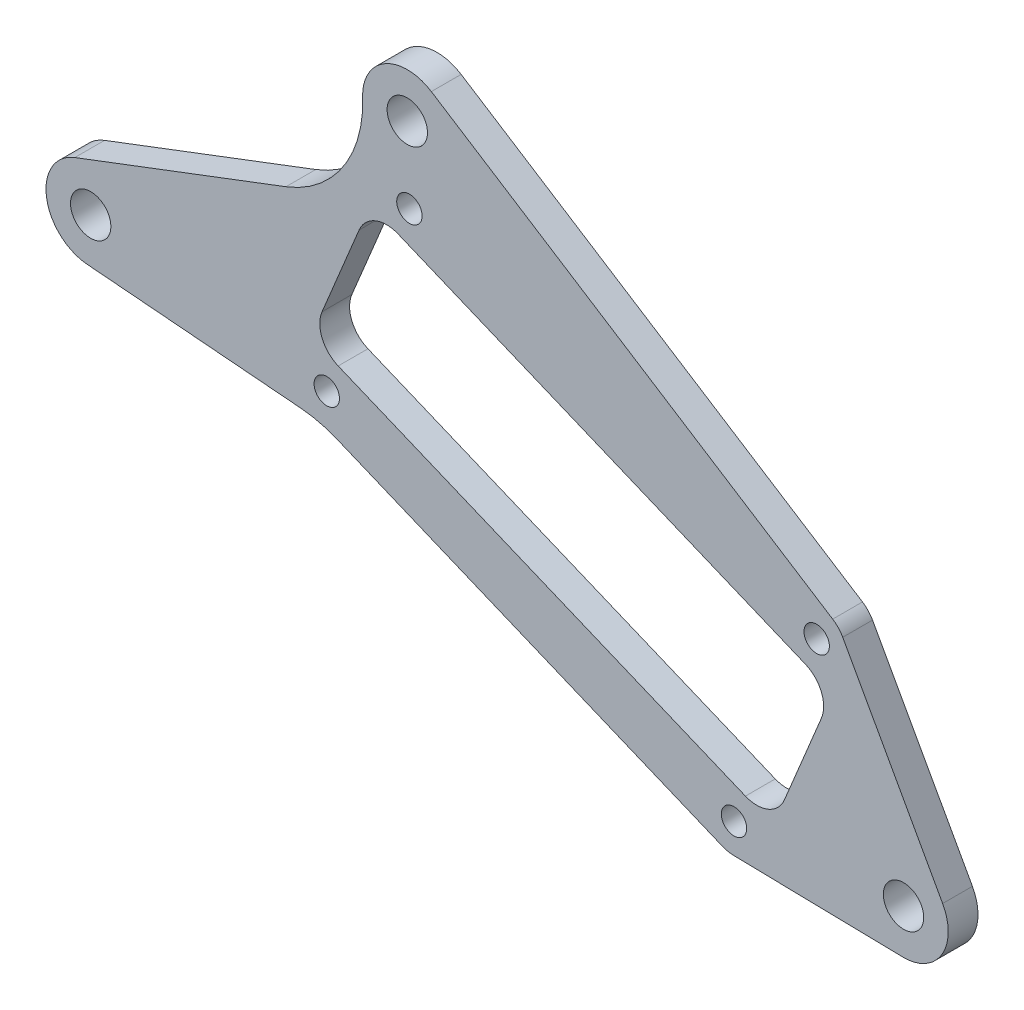
ISO-10303-21;
HEADER;
FILE_DESCRIPTION(('STEP AP214'),'2;1');
FILE_NAME('part.step','',(''),(''),'','','');
FILE_SCHEMA(('AUTOMOTIVE_DESIGN { 1 0 10303 214 1 1 1 1 }'));
ENDSEC;
DATA;
#1=APPLICATION_CONTEXT('core data for automotive mechanical design processes');
#2=APPLICATION_PROTOCOL_DEFINITION('international standard','automotive_design',2000,#1);
#3=PRODUCT_CONTEXT('',#1,'mechanical');
#4=PRODUCT('Part','Part','',(#3));
#5=PRODUCT_RELATED_PRODUCT_CATEGORY('part','',(#4));
#6=PRODUCT_DEFINITION_FORMATION('','',#4);
#7=PRODUCT_DEFINITION_CONTEXT('part definition',#1,'design');
#8=PRODUCT_DEFINITION('design','',#6,#7);
#9=PRODUCT_DEFINITION_SHAPE('','',#8);
#10=(LENGTH_UNIT() NAMED_UNIT(*) SI_UNIT(.MILLI.,.METRE.));
#11=(NAMED_UNIT(*) PLANE_ANGLE_UNIT() SI_UNIT($,.RADIAN.));
#12=(NAMED_UNIT(*) SI_UNIT($,.STERADIAN.) SOLID_ANGLE_UNIT());
#13=UNCERTAINTY_MEASURE_WITH_UNIT(LENGTH_MEASURE(1.E-05),#10,'distance_accuracy_value','');
#14=(GEOMETRIC_REPRESENTATION_CONTEXT(3) GLOBAL_UNCERTAINTY_ASSIGNED_CONTEXT((#13)) GLOBAL_UNIT_ASSIGNED_CONTEXT((#10,
#11,#12)) REPRESENTATION_CONTEXT('',''));
#15=CARTESIAN_POINT('',(0.,0.,0.));
#16=DIRECTION('',(0.,0.,1.));
#17=DIRECTION('',(1.,0.,0.));
#18=AXIS2_PLACEMENT_3D('',#15,#16,#17);
#19=CARTESIAN_POINT('',(3.6054487883952,8.69459000092925,3.175));
#20=DIRECTION('',(-0.383049008063236,-0.923728021347069,0.));
#21=DIRECTION('',(0.923728021347069,-0.383049008063236,0.));
#22=AXIS2_PLACEMENT_3D('',#19,#20,#21);
#23=PLANE('',#22);
#24=DIRECTION('',(-0.923728021347069,0.383049008063236,0.));
#25=VECTOR('',#24,1.);
#26=CARTESIAN_POINT('',(3.6054487883952,8.69459000092925,3.175));
#27=LINE('',#26,#25);
#28=CARTESIAN_POINT('',(69.7997987981253,-18.7547019168819,3.175));
#29=VERTEX_POINT('',#28);
#30=CARTESIAN_POINT('',(26.384581794813,-0.751398537909783,3.175));
#31=VERTEX_POINT('',#30);
#32=EDGE_CURVE('E228',#29,#31,#27,.T.);
#33=ORIENTED_EDGE('',*,*,#32,.F.);
#34=DIRECTION('',(0.,0.,-1.));
#35=VECTOR('',#34,1.);
#36=CARTESIAN_POINT('',(69.7997987981252,-18.7547019168819,3.175));
#37=LINE('',#36,#35);
#38=CARTESIAN_POINT('',(69.7997987981253,-18.7547019168819,0.));
#39=VERTEX_POINT('',#38);
#40=EDGE_CURVE('E297',#29,#39,#37,.T.);
#41=ORIENTED_EDGE('',*,*,#40,.T.);
#42=DIRECTION('',(-0.923728021347069,0.383049008063236,0.));
#43=VECTOR('',#42,1.);
#44=CARTESIAN_POINT('',(3.6054487883952,8.69459000092925,0.));
#45=LINE('',#44,#43);
#46=CARTESIAN_POINT('',(26.384581794813,-0.751398537909783,0.));
#47=VERTEX_POINT('',#46);
#48=EDGE_CURVE('E269',#39,#47,#45,.T.);
#49=ORIENTED_EDGE('',*,*,#48,.T.);
#50=DIRECTION('',(0.,0.,-1.));
#51=VECTOR('',#50,1.);
#52=CARTESIAN_POINT('',(26.384581794813,-0.751398537909778,3.175));
#53=LINE('',#52,#51);
#54=EDGE_CURVE('E201',#47,#31,#53,.F.);
#55=ORIENTED_EDGE('',*,*,#54,.T.);
#56=EDGE_LOOP('',(#33,#41,#49,#55));
#57=FACE_BOUND('',#56,.T.);
#58=ADVANCED_FACE('F35',(#57),#23,.F.);
#59=CARTESIAN_POINT('',(19.8462965386409,-8.22980793823825,3.175));
#60=DIRECTION('',(-0.923728021347069,0.383049008063236,0.));
#61=DIRECTION('',(-0.383049008063236,-0.923728021347069,0.));
#62=AXIS2_PLACEMENT_3D('',#59,#60,#61);
#63=PLANE('',#62);
#64=DIRECTION('',(0.383049008063236,0.923728021347069,0.));
#65=VECTOR('',#64,1.);
#66=CARTESIAN_POINT('',(19.8462965386409,-8.22980793823825,3.175));
#67=LINE('',#66,#65);
#68=CARTESIAN_POINT('',(24.6679259276368,3.39761853046795,3.175));
#69=VERTEX_POINT('',#68);
#70=CARTESIAN_POINT('',(28.6133307106882,12.9120171503427,3.175));
#71=VERTEX_POINT('',#70);
#72=EDGE_CURVE('E231',#69,#71,#67,.T.);
#73=ORIENTED_EDGE('',*,*,#72,.F.);
#74=DIRECTION('',(0.,0.,-1.));
#75=VECTOR('',#74,1.);
#76=CARTESIAN_POINT('',(24.6679259276368,3.39761853046794,0.));
#77=LINE('',#76,#75);
#78=CARTESIAN_POINT('',(24.6679259276368,3.39761853046795,0.));
#79=VERTEX_POINT('',#78);
#80=EDGE_CURVE('E312',#69,#79,#77,.T.);
#81=ORIENTED_EDGE('',*,*,#80,.T.);
#82=DIRECTION('',(0.383049008063236,0.923728021347069,0.));
#83=VECTOR('',#82,1.);
#84=CARTESIAN_POINT('',(19.8462965386409,-8.22980793823825,0.));
#85=LINE('',#84,#83);
#86=CARTESIAN_POINT('',(28.6133307106882,12.9120171503427,0.));
#87=VERTEX_POINT('',#86);
#88=EDGE_CURVE('E272',#79,#87,#85,.T.);
#89=ORIENTED_EDGE('',*,*,#88,.T.);
#90=DIRECTION('',(0.,0.,-1.));
#91=VECTOR('',#90,1.);
#92=CARTESIAN_POINT('',(28.6133307106882,12.9120171503427,3.175));
#93=LINE('',#92,#91);
#94=EDGE_CURVE('E310',#87,#71,#93,.F.);
#95=ORIENTED_EDGE('',*,*,#94,.T.);
#96=EDGE_LOOP('',(#73,#81,#89,#95));
#97=FACE_BOUND('',#96,.T.);
#98=ADVANCED_FACE('F364',(#97),#63,.F.);
#99=CARTESIAN_POINT('',(9.98321477264808,24.0746615563579,3.175));
#100=DIRECTION('',(-0.383049008063236,-0.923728021347069,0.));
#101=DIRECTION('',(0.923728021347069,-0.383049008063236,0.));
#102=AXIS2_PLACEMENT_3D('',#99,#100,#101);
#103=PLANE('',#102);
#104=DIRECTION('',(-0.923728021347069,0.383049008063236,0.));
#105=VECTOR('',#104,1.);
#106=CARTESIAN_POINT('',(9.98321477264808,24.0746615563579,0.));
#107=LINE('',#106,#105);
#108=CARTESIAN_POINT('',(76.1775647823781,-3.37463036145321,0.));
#109=VERTEX_POINT('',#108);
#110=CARTESIAN_POINT('',(32.7623477790659,14.6286730175189,0.));
#111=VERTEX_POINT('',#110);
#112=EDGE_CURVE('E275',#109,#111,#107,.T.);
#113=ORIENTED_EDGE('',*,*,#112,.F.);
#114=DIRECTION('',(0.,0.,-1.));
#115=VECTOR('',#114,1.);
#116=CARTESIAN_POINT('',(76.1775647823781,-3.37463036145321,3.175));
#117=LINE('',#116,#115);
#118=CARTESIAN_POINT('',(76.1775647823781,-3.37463036145321,3.175));
#119=VERTEX_POINT('',#118);
#120=EDGE_CURVE('E308',#109,#119,#117,.F.);
#121=ORIENTED_EDGE('',*,*,#120,.T.);
#122=DIRECTION('',(-0.923728021347069,0.383049008063236,0.));
#123=VECTOR('',#122,1.);
#124=CARTESIAN_POINT('',(9.98321477264808,24.0746615563579,3.175));
#125=LINE('',#124,#123);
#126=CARTESIAN_POINT('',(32.7623477790659,14.6286730175189,3.175));
#127=VERTEX_POINT('',#126);
#128=EDGE_CURVE('E234',#119,#127,#125,.T.);
#129=ORIENTED_EDGE('',*,*,#128,.T.);
#130=DIRECTION('',(0.,0.,-1.));
#131=VECTOR('',#130,1.);
#132=CARTESIAN_POINT('',(32.7623477790659,14.6286730175189,3.175));
#133=LINE('',#132,#131);
#134=EDGE_CURVE('E305',#127,#111,#133,.T.);
#135=ORIENTED_EDGE('',*,*,#134,.T.);
#136=EDGE_LOOP('',(#113,#121,#129,#135));
#137=FACE_BOUND('',#136,.T.);
#138=ADVANCED_FACE('F370',(#137),#103,.T.);
#139=CARTESIAN_POINT('',(-0.39436124862565,-4.74614427252084,3.175));
#140=DIRECTION('',(0.0828055115224462,0.996565726513563,0.));
#141=DIRECTION('',(-0.996565726513563,0.0828055115224462,0.));
#142=AXIS2_PLACEMENT_3D('',#139,#140,#141);
#143=PLANE('',#142);
#144=DIRECTION('',(0.996565726513563,-0.0828055115224462,0.));
#145=VECTOR('',#144,1.);
#146=CARTESIAN_POINT('',(-0.39436124862565,-4.74614427252084,0.));
#147=LINE('',#146,#145);
#148=CARTESIAN_POINT('',(-0.39436124862565,-4.74614427252084,0.));
#149=VERTEX_POINT('',#148);
#150=CARTESIAN_POINT('',(22.4319156239674,-6.64279943765543,0.));
#151=VERTEX_POINT('',#150);
#152=EDGE_CURVE('E241',#149,#151,#147,.T.);
#153=ORIENTED_EDGE('',*,*,#152,.T.);
#154=DIRECTION('',(0.,0.,-1.));
#155=VECTOR('',#154,1.);
#156=CARTESIAN_POINT('',(22.4319156239674,-6.64279943765543,3.175));
#157=LINE('',#156,#155);
#158=CARTESIAN_POINT('',(22.4319156239674,-6.64279943765543,3.175));
#159=VERTEX_POINT('',#158);
#160=EDGE_CURVE('E333',#151,#159,#157,.F.);
#161=ORIENTED_EDGE('',*,*,#160,.T.);
#162=DIRECTION('',(0.996565726513563,-0.0828055115224462,0.));
#163=VECTOR('',#162,1.);
#164=CARTESIAN_POINT('',(-0.39436124862565,-4.74614427252084,3.175));
#165=LINE('',#164,#163);
#166=CARTESIAN_POINT('',(-0.39436124862565,-4.74614427252084,3.175));
#167=VERTEX_POINT('',#166);
#168=EDGE_CURVE('E191',#167,#159,#165,.T.);
#169=ORIENTED_EDGE('',*,*,#168,.F.);
#170=DIRECTION('',(0.,0.,-1.));
#171=VECTOR('',#170,1.);
#172=CARTESIAN_POINT('',(-0.39436124862565,-4.74614427252084,3.175));
#173=LINE('',#172,#171);
#174=EDGE_CURVE('E240',#167,#149,#173,.T.);
#175=ORIENTED_EDGE('',*,*,#174,.T.);
#176=EDGE_LOOP('',(#153,#161,#169,#175));
#177=FACE_BOUND('',#176,.T.);
#178=ADVANCED_FACE('F348',(#177),#143,.F.);
#179=CARTESIAN_POINT('',(1.17308758719365,2.82891706537536,3.175));
#180=DIRECTION('',(0.383049008063236,0.923728021347069,0.));
#181=DIRECTION('',(-0.923728021347069,0.383049008063236,0.));
#182=AXIS2_PLACEMENT_3D('',#179,#180,#181);
#183=PLANE('',#182);
#184=DIRECTION('',(0.923728021347069,-0.383049008063236,0.));
#185=VECTOR('',#184,1.);
#186=CARTESIAN_POINT('',(1.17308758719365,2.82891706537536,3.175));
#187=LINE('',#186,#185);
#188=CARTESIAN_POINT('',(26.2450080300355,-7.56783829326991,3.175));
#189=VERTEX_POINT('',#188);
#190=CARTESIAN_POINT('',(67.3674375969237,-24.6203748524358,3.175));
#191=VERTEX_POINT('',#190);
#192=EDGE_CURVE('E177',#189,#191,#187,.T.);
#193=ORIENTED_EDGE('',*,*,#192,.F.);
#194=DIRECTION('',(0.,0.,-1.));
#195=VECTOR('',#194,1.);
#196=CARTESIAN_POINT('',(26.2450080300355,-7.56783829326991,0.));
#197=LINE('',#196,#195);
#198=CARTESIAN_POINT('',(26.2450080300355,-7.56783829326991,0.));
#199=VERTEX_POINT('',#198);
#200=EDGE_CURVE('E331',#189,#199,#197,.T.);
#201=ORIENTED_EDGE('',*,*,#200,.T.);
#202=DIRECTION('',(0.923728021347069,-0.383049008063236,0.));
#203=VECTOR('',#202,1.);
#204=CARTESIAN_POINT('',(1.17308758719365,2.82891706537536,0.));
#205=LINE('',#204,#203);
#206=CARTESIAN_POINT('',(67.3674375969237,-24.6203748524358,0.));
#207=VERTEX_POINT('',#206);
#208=EDGE_CURVE('E197',#199,#207,#205,.T.);
#209=ORIENTED_EDGE('',*,*,#208,.T.);
#210=DIRECTION('',(0.,0.,-1.));
#211=VECTOR('',#210,1.);
#212=CARTESIAN_POINT('',(67.3674375969237,-24.6203748524358,3.175));
#213=LINE('',#212,#211);
#214=EDGE_CURVE('E194',#191,#207,#213,.T.);
#215=ORIENTED_EDGE('',*,*,#214,.F.);
#216=EDGE_LOOP('',(#193,#201,#209,#215));
#217=FACE_BOUND('',#216,.T.);
#218=ADVANCED_FACE('F195',(#217),#183,.F.);
#219=CARTESIAN_POINT('',(68.5836181975244,-21.6875383846588,3.175));
#220=DIRECTION('',(0.,0.,-1.));
#221=DIRECTION('',(-1.,0.,0.));
#222=AXIS2_PLACEMENT_3D('',#219,#220,#221);
#223=CYLINDRICAL_SURFACE('',#222,3.175);
#224=CARTESIAN_POINT('',(68.5836181975244,-21.6875383846588,0.));
#225=DIRECTION('',(0.,0.,1.));
#226=DIRECTION('',(1.,0.,0.));
#227=AXIS2_PLACEMENT_3D('',#224,#225,#226);
#228=CIRCLE('',#227,3.175);
#229=CARTESIAN_POINT('',(68.519252784024,-24.8618858913986,0.));
#230=VERTEX_POINT('',#229);
#231=EDGE_CURVE('E246',#207,#230,#228,.T.);
#232=ORIENTED_EDGE('',*,*,#231,.T.);
#233=DIRECTION('',(0.,0.,-1.));
#234=VECTOR('',#233,1.);
#235=CARTESIAN_POINT('',(68.519252784024,-24.8618858913986,3.175));
#236=LINE('',#235,#234);
#237=CARTESIAN_POINT('',(68.519252784024,-24.8618858913986,3.175));
#238=VERTEX_POINT('',#237);
#239=EDGE_CURVE('E202',#238,#230,#236,.T.);
#240=ORIENTED_EDGE('',*,*,#239,.F.);
#241=CARTESIAN_POINT('',(68.5836181975244,-21.6875383846588,3.175));
#242=DIRECTION('',(0.,0.,1.));
#243=DIRECTION('',(1.,0.,0.));
#244=AXIS2_PLACEMENT_3D('',#241,#242,#243);
#245=CIRCLE('',#244,3.175);
#246=EDGE_CURVE('E184',#191,#238,#245,.T.);
#247=ORIENTED_EDGE('',*,*,#246,.F.);
#248=ORIENTED_EDGE('',*,*,#214,.T.);
#249=EDGE_LOOP('',(#232,#240,#247,#248));
#250=FACE_BOUND('',#249,.T.);
#251=ADVANCED_FACE('F204',(#250),#223,.T.);
#252=CARTESIAN_POINT('',(-0.47575092489974,-23.4628922608135,3.175));
#253=DIRECTION('',(-0.0202725711812555,-0.999794490311734,0.));
#254=DIRECTION('',(0.999794490311735,-0.0202725711812555,0.));
#255=AXIS2_PLACEMENT_3D('',#252,#253,#254);
#256=PLANE('',#255);
#257=DIRECTION('',(-0.999794490311735,0.0202725711812555,0.));
#258=VECTOR('',#257,1.);
#259=CARTESIAN_POINT('',(-0.47575092489974,-23.4628922608135,0.));
#260=LINE('',#259,#258);
#261=CARTESIAN_POINT('',(86.5571780105177,-25.2276361797426,0.));
#262=VERTEX_POINT('',#261);
#263=EDGE_CURVE('E248',#262,#230,#260,.T.);
#264=ORIENTED_EDGE('',*,*,#263,.F.);
#265=DIRECTION('',(0.,0.,-1.));
#266=VECTOR('',#265,1.);
#267=CARTESIAN_POINT('',(86.5571780105177,-25.2276361797426,3.175));
#268=LINE('',#267,#266);
#269=CARTESIAN_POINT('',(86.5571780105177,-25.2276361797426,3.175));
#270=VERTEX_POINT('',#269);
#271=EDGE_CURVE('E293',#270,#262,#268,.T.);
#272=ORIENTED_EDGE('',*,*,#271,.F.);
#273=DIRECTION('',(-0.999794490311735,0.0202725711812555,0.));
#274=VECTOR('',#273,1.);
#275=CARTESIAN_POINT('',(-0.47575092489974,-23.4628922608135,3.175));
#276=LINE('',#275,#274);
#277=EDGE_CURVE('E206',#270,#238,#276,.T.);
#278=ORIENTED_EDGE('',*,*,#277,.T.);
#279=ORIENTED_EDGE('',*,*,#239,.T.);
#280=EDGE_LOOP('',(#264,#272,#278,#279));
#281=FACE_BOUND('',#280,.T.);
#282=ADVANCED_FACE('F403',(#281),#256,.T.);
#283=CARTESIAN_POINT('',(86.6537261307684,-20.4661149196329,3.175));
#284=DIRECTION('',(0.,0.,-1.));
#285=DIRECTION('',(-1.,0.,0.));
#286=AXIS2_PLACEMENT_3D('',#283,#284,#285);
#287=CYLINDRICAL_SURFACE('',#286,4.7625);
#288=CARTESIAN_POINT('',(86.6537261307684,-20.4661149196329,0.));
#289=DIRECTION('',(0.,0.,1.));
#290=DIRECTION('',(1.,0.,0.));
#291=AXIS2_PLACEMENT_3D('',#288,#289,#290);
#292=CIRCLE('',#291,4.7625);
#293=CARTESIAN_POINT('',(90.8213588264663,-18.1612843480398,0.));
#294=VERTEX_POINT('',#293);
#295=EDGE_CURVE('E251',#262,#294,#292,.T.);
#296=ORIENTED_EDGE('',*,*,#295,.T.);
#297=DIRECTION('',(0.,0.,-1.));
#298=VECTOR('',#297,1.);
#299=CARTESIAN_POINT('',(90.8213588264663,-18.1612843480398,3.175));
#300=LINE('',#299,#298);
#301=CARTESIAN_POINT('',(90.8213588264663,-18.1612843480398,3.175));
#302=VERTEX_POINT('',#301);
#303=EDGE_CURVE('E291',#302,#294,#300,.T.);
#304=ORIENTED_EDGE('',*,*,#303,.F.);
#305=CARTESIAN_POINT('',(86.6537261307684,-20.4661149196329,3.175));
#306=DIRECTION('',(0.,0.,1.));
#307=DIRECTION('',(1.,0.,0.));
#308=AXIS2_PLACEMENT_3D('',#305,#306,#307);
#309=CIRCLE('',#308,4.7625);
#310=EDGE_CURVE('E208',#270,#302,#309,.T.);
#311=ORIENTED_EDGE('',*,*,#310,.F.);
#312=ORIENTED_EDGE('',*,*,#271,.T.);
#313=EDGE_LOOP('',(#296,#304,#311,#312));
#314=FACE_BOUND('',#313,.T.);
#315=ADVANCED_FACE('F399',(#314),#287,.T.);
#316=CARTESIAN_POINT('',(61.8585676556728,34.2097128652754,3.175));
#317=DIRECTION('',(0.87509347941162,0.483953925793834,0.));
#318=DIRECTION('',(-0.483953925793834,0.875093479411621,0.));
#319=AXIS2_PLACEMENT_3D('',#316,#317,#318);
#320=PLANE('',#319);
#321=DIRECTION('',(0.483953925793834,-0.875093479411621,0.));
#322=VECTOR('',#321,1.);
#323=CARTESIAN_POINT('',(61.8585676556728,34.2097128652754,0.));
#324=LINE('',#323,#322);
#325=CARTESIAN_POINT('',(80.1721671801108,1.09475982071917,0.));
#326=VERTEX_POINT('',#325);
#327=EDGE_CURVE('E254',#326,#294,#324,.T.);
#328=ORIENTED_EDGE('',*,*,#327,.F.);
#329=DIRECTION('',(0.,0.,-1.));
#330=VECTOR('',#329,1.);
#331=CARTESIAN_POINT('',(80.1721671801108,1.09475982071917,3.175));
#332=LINE('',#331,#330);
#333=CARTESIAN_POINT('',(80.1721671801108,1.09475982071917,3.175));
#334=VERTEX_POINT('',#333);
#335=EDGE_CURVE('E289',#334,#326,#332,.T.);
#336=ORIENTED_EDGE('',*,*,#335,.F.);
#337=DIRECTION('',(0.483953925793834,-0.875093479411621,0.));
#338=VECTOR('',#337,1.);
#339=CARTESIAN_POINT('',(61.8585676556728,34.2097128652754,3.175));
#340=LINE('',#339,#338);
#341=EDGE_CURVE('E213',#334,#302,#340,.T.);
#342=ORIENTED_EDGE('',*,*,#341,.T.);
#343=ORIENTED_EDGE('',*,*,#303,.T.);
#344=EDGE_LOOP('',(#328,#336,#342,#343));
#345=FACE_BOUND('',#344,.T.);
#346=ADVANCED_FACE('F395',(#345),#320,.T.);
#347=CARTESIAN_POINT('',(77.3937453829789,-0.441793893676247,3.175));
#348=DIRECTION('',(0.,0.,-1.));
#349=DIRECTION('',(-1.,0.,0.));
#350=AXIS2_PLACEMENT_3D('',#347,#348,#349);
#351=CYLINDRICAL_SURFACE('',#350,3.175);
#352=CARTESIAN_POINT('',(77.3937453829789,-0.441793893676247,0.));
#353=DIRECTION('',(0.,0.,1.));
#354=DIRECTION('',(1.,0.,0.));
#355=AXIS2_PLACEMENT_3D('',#352,#353,#354);
#356=CIRCLE('',#355,3.175);
#357=CARTESIAN_POINT('',(79.1020142667995,2.23448008717289,0.));
#358=VERTEX_POINT('',#357);
#359=EDGE_CURVE('E257',#326,#358,#356,.T.);
#360=ORIENTED_EDGE('',*,*,#359,.T.);
#361=DIRECTION('',(0.,0.,-1.));
#362=VECTOR('',#361,1.);
#363=CARTESIAN_POINT('',(79.1020142667995,2.23448008717289,3.175));
#364=LINE('',#363,#362);
#365=CARTESIAN_POINT('',(79.1020142667995,2.23448008717289,3.175));
#366=VERTEX_POINT('',#365);
#367=EDGE_CURVE('E287',#366,#358,#364,.T.);
#368=ORIENTED_EDGE('',*,*,#367,.F.);
#369=CARTESIAN_POINT('',(77.3937453829789,-0.441793893676247,3.175));
#370=DIRECTION('',(0.,0.,1.));
#371=DIRECTION('',(1.,0.,0.));
#372=AXIS2_PLACEMENT_3D('',#369,#370,#371);
#373=CIRCLE('',#372,3.175);
#374=EDGE_CURVE('E216',#334,#366,#373,.T.);
#375=ORIENTED_EDGE('',*,*,#374,.F.);
#376=ORIENTED_EDGE('',*,*,#335,.T.);
#377=EDGE_LOOP('',(#360,#368,#375,#376));
#378=FACE_BOUND('',#377,.T.);
#379=ADVANCED_FACE('F391',(#378),#351,.T.);
#380=CARTESIAN_POINT('',(23.9121786780269,37.4622181715844,3.175));
#381=DIRECTION('',(0.538037443723045,0.842920938850122,0.));
#382=DIRECTION('',(-0.842920938850122,0.538037443723045,0.));
#383=AXIS2_PLACEMENT_3D('',#380,#381,#382);
#384=PLANE('',#383);
#385=DIRECTION('',(0.842920938850122,-0.538037443723045,0.));
#386=VECTOR('',#385,1.);
#387=CARTESIAN_POINT('',(23.9121786780269,37.4622181715844,0.));
#388=LINE('',#387,#386);
#389=CARTESIAN_POINT('',(36.3157980254566,29.5449731026594,0.));
#390=VERTEX_POINT('',#389);
#391=EDGE_CURVE('E260',#390,#358,#388,.T.);
#392=ORIENTED_EDGE('',*,*,#391,.F.);
#393=DIRECTION('',(0.,0.,-1.));
#394=VECTOR('',#393,1.);
#395=CARTESIAN_POINT('',(36.3157980254566,29.5449731026594,3.175));
#396=LINE('',#395,#394);
#397=CARTESIAN_POINT('',(36.3157980254566,29.5449731026594,3.175));
#398=VERTEX_POINT('',#397);
#399=EDGE_CURVE('E285',#398,#390,#396,.T.);
#400=ORIENTED_EDGE('',*,*,#399,.F.);
#401=DIRECTION('',(0.842920938850122,-0.538037443723045,0.));
#402=VECTOR('',#401,1.);
#403=CARTESIAN_POINT('',(23.9121786780269,37.4622181715844,3.175));
#404=LINE('',#403,#402);
#405=EDGE_CURVE('E218',#398,#366,#404,.T.);
#406=ORIENTED_EDGE('',*,*,#405,.T.);
#407=ORIENTED_EDGE('',*,*,#367,.T.);
#408=EDGE_LOOP('',(#392,#400,#406,#407));
#409=FACE_BOUND('',#408,.T.);
#410=ADVANCED_FACE('F388',(#409),#384,.T.);
#411=CARTESIAN_POINT('',(33.7533946997256,25.5305621313857,3.175));
#412=DIRECTION('',(0.,0.,-1.));
#413=DIRECTION('',(-1.,0.,0.));
#414=AXIS2_PLACEMENT_3D('',#411,#412,#413);
#415=CYLINDRICAL_SURFACE('',#414,4.7625);
#416=CARTESIAN_POINT('',(33.7533946997256,25.5305621313857,0.));
#417=DIRECTION('',(0.,0.,1.));
#418=DIRECTION('',(1.,0.,0.));
#419=AXIS2_PLACEMENT_3D('',#416,#417,#418);
#420=CIRCLE('',#419,4.7625);
#421=CARTESIAN_POINT('',(28.9941713479063,25.3539287894091,0.));
#422=VERTEX_POINT('',#421);
#423=EDGE_CURVE('E263',#390,#422,#420,.T.);
#424=ORIENTED_EDGE('',*,*,#423,.T.);
#425=DIRECTION('',(0.,0.,-1.));
#426=VECTOR('',#425,1.);
#427=CARTESIAN_POINT('',(28.9941713479063,25.3539287894091,3.175));
#428=LINE('',#427,#426);
#429=CARTESIAN_POINT('',(28.9941713479063,25.3539287894091,3.175));
#430=VERTEX_POINT('',#429);
#431=EDGE_CURVE('E50',#422,#430,#428,.F.);
#432=ORIENTED_EDGE('',*,*,#431,.T.);
#433=CARTESIAN_POINT('',(33.7533946997256,25.5305621313857,3.175));
#434=DIRECTION('',(0.,0.,1.));
#435=DIRECTION('',(1.,0.,0.));
#436=AXIS2_PLACEMENT_3D('',#433,#434,#435);
#437=CIRCLE('',#436,4.7625);
#438=EDGE_CURVE('E221',#398,#430,#437,.T.);
#439=ORIENTED_EDGE('',*,*,#438,.F.);
#440=ORIENTED_EDGE('',*,*,#399,.T.);
#441=EDGE_LOOP('',(#424,#432,#439,#440));
#442=FACE_BOUND('',#441,.T.);
#443=ADVANCED_FACE('F384',(#442),#415,.T.);
#444=CARTESIAN_POINT('',(-1.69293536920437,4.45144651609978,3.175));
#445=DIRECTION('',(-0.355471993533725,0.93468693251439,0.));
#446=DIRECTION('',(-0.93468693251439,-0.355471993533725,0.));
#447=AXIS2_PLACEMENT_3D('',#444,#445,#446);
#448=PLANE('',#447);
#449=DIRECTION('',(0.93468693251439,0.355471993533725,0.));
#450=VECTOR('',#449,1.);
#451=CARTESIAN_POINT('',(-1.69293536920437,4.45144651609978,3.175));
#452=LINE('',#451,#450);
#453=CARTESIAN_POINT('',(-1.69293536920437,4.45144651609978,3.175));
#454=VERTEX_POINT('',#453);
#455=CARTESIAN_POINT('',(20.8174033942664,13.0123825012054,3.175));
#456=VERTEX_POINT('',#455);
#457=EDGE_CURVE('E223',#454,#456,#452,.T.);
#458=ORIENTED_EDGE('',*,*,#457,.T.);
#459=DIRECTION('',(0.,0.,-1.));
#460=VECTOR('',#459,1.);
#461=CARTESIAN_POINT('',(20.8174033942664,13.0123825012054,3.175));
#462=LINE('',#461,#460);
#463=CARTESIAN_POINT('',(20.8174033942664,13.0123825012054,0.));
#464=VERTEX_POINT('',#463);
#465=EDGE_CURVE('E335',#456,#464,#462,.T.);
#466=ORIENTED_EDGE('',*,*,#465,.T.);
#467=DIRECTION('',(0.93468693251439,0.355471993533725,0.));
#468=VECTOR('',#467,1.);
#469=CARTESIAN_POINT('',(-1.69293536920437,4.45144651609978,0.));
#470=LINE('',#469,#468);
#471=CARTESIAN_POINT('',(-1.69293536920437,4.45144651609978,0.));
#472=VERTEX_POINT('',#471);
#473=EDGE_CURVE('E265',#472,#464,#470,.T.);
#474=ORIENTED_EDGE('',*,*,#473,.F.);
#475=DIRECTION('',(0.,0.,-1.));
#476=VECTOR('',#475,1.);
#477=CARTESIAN_POINT('',(-1.69293536920437,4.45144651609978,3.175));
#478=LINE('',#477,#476);
#479=EDGE_CURVE('E283',#454,#472,#478,.T.);
#480=ORIENTED_EDGE('',*,*,#479,.F.);
#481=EDGE_LOOP('',(#458,#466,#474,#480));
#482=FACE_BOUND('',#481,.T.);
#483=ADVANCED_FACE('F380',(#482),#448,.T.);
#484=CARTESIAN_POINT('',(0.,0.,3.175));
#485=DIRECTION('',(0.,0.,-1.));
#486=DIRECTION('',(-1.,0.,0.));
#487=AXIS2_PLACEMENT_3D('',#484,#485,#486);
#488=CYLINDRICAL_SURFACE('',#487,4.7625);
#489=CARTESIAN_POINT('',(0.,0.,0.));
#490=DIRECTION('',(0.,0.,1.));
#491=DIRECTION('',(1.,0.,0.));
#492=AXIS2_PLACEMENT_3D('',#489,#490,#491);
#493=CIRCLE('',#492,4.7625);
#494=EDGE_CURVE('E267',#472,#149,#493,.T.);
#495=ORIENTED_EDGE('',*,*,#494,.T.);
#496=ORIENTED_EDGE('',*,*,#174,.F.);
#497=CARTESIAN_POINT('',(0.,0.,3.175));
#498=DIRECTION('',(0.,0.,1.));
#499=DIRECTION('',(1.,0.,0.));
#500=AXIS2_PLACEMENT_3D('',#497,#498,#499);
#501=CIRCLE('',#500,4.7625);
#502=EDGE_CURVE('E226',#454,#167,#501,.T.);
#503=ORIENTED_EDGE('',*,*,#502,.F.);
#504=ORIENTED_EDGE('',*,*,#479,.T.);
#505=EDGE_LOOP('',(#495,#496,#503,#504));
#506=FACE_BOUND('',#505,.T.);
#507=ADVANCED_FACE('F376',(#506),#488,.T.);
#508=CARTESIAN_POINT('',(69.1271864775069,-28.665472518412,3.175));
#509=DIRECTION('',(-0.923728021347068,0.383049008063237,0.));
#510=DIRECTION('',(-0.383049008063237,-0.923728021347069,0.));
#511=AXIS2_PLACEMENT_3D('',#508,#509,#510);
#512=PLANE('',#511);
#513=DIRECTION('',(0.383049008063237,0.923728021347069,0.));
#514=VECTOR('',#513,1.);
#515=CARTESIAN_POINT('',(69.1271864775069,-28.665472518412,0.));
#516=LINE('',#515,#514);
#517=CARTESIAN_POINT('',(73.948815866503,-17.0380460497057,0.));
#518=VERTEX_POINT('',#517);
#519=CARTESIAN_POINT('',(77.8942206495543,-7.52364742983092,0.));
#520=VERTEX_POINT('',#519);
#521=EDGE_CURVE('E278',#518,#520,#516,.T.);
#522=ORIENTED_EDGE('',*,*,#521,.F.);
#523=DIRECTION('',(0.,0.,-1.));
#524=VECTOR('',#523,1.);
#525=CARTESIAN_POINT('',(73.948815866503,-17.0380460497057,3.175));
#526=LINE('',#525,#524);
#527=CARTESIAN_POINT('',(73.948815866503,-17.0380460497057,3.175));
#528=VERTEX_POINT('',#527);
#529=EDGE_CURVE('E303',#518,#528,#526,.F.);
#530=ORIENTED_EDGE('',*,*,#529,.T.);
#531=DIRECTION('',(0.383049008063237,0.923728021347069,0.));
#532=VECTOR('',#531,1.);
#533=CARTESIAN_POINT('',(69.1271864775069,-28.665472518412,3.175));
#534=LINE('',#533,#532);
#535=CARTESIAN_POINT('',(77.8942206495543,-7.52364742983092,3.175));
#536=VERTEX_POINT('',#535);
#537=EDGE_CURVE('E237',#528,#536,#534,.T.);
#538=ORIENTED_EDGE('',*,*,#537,.T.);
#539=DIRECTION('',(0.,0.,-1.));
#540=VECTOR('',#539,1.);
#541=CARTESIAN_POINT('',(77.8942206495543,-7.52364742983092,0.));
#542=LINE('',#541,#540);
#543=EDGE_CURVE('E300',#536,#520,#542,.T.);
#544=ORIENTED_EDGE('',*,*,#543,.T.);
#545=EDGE_LOOP('',(#522,#530,#538,#544));
#546=FACE_BOUND('',#545,.T.);
#547=ADVANCED_FACE('F379',(#546),#512,.T.);
#548=CARTESIAN_POINT('',(0.,0.,3.175));
#549=DIRECTION('',(0.,0.,1.));
#550=DIRECTION('',(1.,0.,0.));
#551=AXIS2_PLACEMENT_3D('',#548,#549,#550);
#552=PLANE('',#551);
#553=CARTESIAN_POINT('',(33.9785283796666,17.5615094852959,3.175));
#554=DIRECTION('',(0.,0.,1.));
#555=DIRECTION('',(1.,0.,0.));
#556=AXIS2_PLACEMENT_3D('',#553,#554,#555);
#557=CIRCLE('',#556,1.35254999999999);
#558=CARTESIAN_POINT('',(35.3310783796666,17.5615094852959,3.175));
#559=VERTEX_POINT('',#558);
#560=EDGE_CURVE('E691',#559,#559,#557,.T.);
#561=ORIENTED_EDGE('',*,*,#560,.F.);
#562=EDGE_LOOP('',(#561));
#563=FACE_BOUND('',#562,.T.);
#564=CARTESIAN_POINT('',(77.3937453829789,-0.441793893676247,3.175));
#565=DIRECTION('',(0.,0.,1.));
#566=DIRECTION('',(1.,0.,0.));
#567=AXIS2_PLACEMENT_3D('',#564,#565,#566);
#568=CIRCLE('',#567,1.35254999999999);
#569=CARTESIAN_POINT('',(78.7462953829789,-0.441793893676247,3.175));
#570=VERTEX_POINT('',#569);
#571=EDGE_CURVE('E686',#570,#570,#568,.T.);
#572=ORIENTED_EDGE('',*,*,#571,.F.);
#573=EDGE_LOOP('',(#572));
#574=FACE_BOUND('',#573,.T.);
#575=CARTESIAN_POINT('',(68.5836181975244,-21.6875383846588,3.175));
#576=DIRECTION('',(0.,0.,1.));
#577=DIRECTION('',(1.,0.,0.));
#578=AXIS2_PLACEMENT_3D('',#575,#576,#577);
#579=CIRCLE('',#578,1.35254999999999);
#580=CARTESIAN_POINT('',(69.9361681975244,-21.6875383846588,3.175));
#581=VERTEX_POINT('',#580);
#582=EDGE_CURVE('E680',#581,#581,#579,.T.);
#583=ORIENTED_EDGE('',*,*,#582,.F.);
#584=EDGE_LOOP('',(#583));
#585=FACE_BOUND('',#584,.T.);
#586=CARTESIAN_POINT('',(25.1684011942122,-3.68423500568672,3.175));
#587=DIRECTION('',(0.,0.,1.));
#588=DIRECTION('',(1.,0.,0.));
#589=AXIS2_PLACEMENT_3D('',#586,#587,#588);
#590=CIRCLE('',#589,1.35254999999999);
#591=CARTESIAN_POINT('',(26.5209511942122,-3.68423500568672,3.175));
#592=VERTEX_POINT('',#591);
#593=EDGE_CURVE('E674',#592,#592,#590,.T.);
#594=ORIENTED_EDGE('',*,*,#593,.F.);
#595=EDGE_LOOP('',(#594));
#596=FACE_BOUND('',#595,.T.);
#597=CARTESIAN_POINT('',(0.,0.,3.175));
#598=DIRECTION('',(0.,0.,1.));
#599=DIRECTION('',(1.,0.,0.));
#600=AXIS2_PLACEMENT_3D('',#597,#598,#599);
#601=CIRCLE('',#600,2.15264999999999);
#602=CARTESIAN_POINT('',(2.15264999999999,0.,3.175));
#603=VERTEX_POINT('',#602);
#604=EDGE_CURVE('E641',#603,#603,#601,.T.);
#605=ORIENTED_EDGE('',*,*,#604,.F.);
#606=EDGE_LOOP('',(#605));
#607=FACE_BOUND('',#606,.T.);
#608=CARTESIAN_POINT('',(33.7533946997256,25.5305621313857,3.175));
#609=DIRECTION('',(0.,0.,1.));
#610=DIRECTION('',(1.,0.,0.));
#611=AXIS2_PLACEMENT_3D('',#608,#609,#610);
#612=CIRCLE('',#611,2.15264999999999);
#613=CARTESIAN_POINT('',(35.9060446997256,25.5305621313857,3.175));
#614=VERTEX_POINT('',#613);
#615=EDGE_CURVE('E634',#614,#614,#612,.T.);
#616=ORIENTED_EDGE('',*,*,#615,.F.);
#617=EDGE_LOOP('',(#616));
#618=FACE_BOUND('',#617,.T.);
#619=CARTESIAN_POINT('',(86.6537261307684,-20.4661149196329,3.175));
#620=DIRECTION('',(0.,0.,1.));
#621=DIRECTION('',(1.,0.,0.));
#622=AXIS2_PLACEMENT_3D('',#619,#620,#621);
#623=CIRCLE('',#622,2.15264999999999);
#624=CARTESIAN_POINT('',(88.8063761307684,-20.4661149196329,3.175));
#625=VERTEX_POINT('',#624);
#626=EDGE_CURVE('E638',#625,#625,#623,.T.);
#627=ORIENTED_EDGE('',*,*,#626,.F.);
#628=EDGE_LOOP('',(#627));
#629=FACE_BOUND('',#628,.T.);
#630=ORIENTED_EDGE('',*,*,#168,.T.);
#631=CARTESIAN_POINT('',(21.3802856276324,-19.2991841643777,3.175));
#632=DIRECTION('',(0.,0.,1.));
#633=DIRECTION('',(1.,0.,0.));
#634=AXIS2_PLACEMENT_3D('',#631,#632,#633);
#635=CIRCLE('',#634,12.7);
#636=EDGE_CURVE('E187',#159,#189,#635,.F.);
#637=ORIENTED_EDGE('',*,*,#636,.T.);
#638=ORIENTED_EDGE('',*,*,#192,.T.);
#639=ORIENTED_EDGE('',*,*,#246,.T.);
#640=ORIENTED_EDGE('',*,*,#277,.F.);
#641=ORIENTED_EDGE('',*,*,#310,.T.);
#642=ORIENTED_EDGE('',*,*,#341,.F.);
#643=ORIENTED_EDGE('',*,*,#374,.T.);
#644=ORIENTED_EDGE('',*,*,#405,.F.);
#645=ORIENTED_EDGE('',*,*,#438,.T.);
#646=CARTESIAN_POINT('',(16.3029090763881,24.8829065441382,3.175));
#647=DIRECTION('',(0.,0.,1.));
#648=DIRECTION('',(1.,0.,0.));
#649=AXIS2_PLACEMENT_3D('',#646,#647,#648);
#650=CIRCLE('',#649,12.7);
#651=EDGE_CURVE('E11',#430,#456,#650,.F.);
#652=ORIENTED_EDGE('',*,*,#651,.T.);
#653=ORIENTED_EDGE('',*,*,#457,.F.);
#654=ORIENTED_EDGE('',*,*,#502,.T.);
#655=EDGE_LOOP('',(#630,#637,#638,#639,#640,#641,#642,#643,#644,#645,#652,#653,#654));
#656=FACE_BOUND('',#655,.T.);
#657=ORIENTED_EDGE('',*,*,#537,.F.);
#658=CARTESIAN_POINT('',(71.015979398726,-15.8218654491049,3.175));
#659=DIRECTION('',(0.,0.,1.));
#660=DIRECTION('',(1.,0.,0.));
#661=AXIS2_PLACEMENT_3D('',#658,#659,#660);
#662=CIRCLE('',#661,3.175);
#663=EDGE_CURVE('E317',#528,#29,#662,.F.);
#664=ORIENTED_EDGE('',*,*,#663,.T.);
#665=ORIENTED_EDGE('',*,*,#32,.T.);
#666=CARTESIAN_POINT('',(27.6007623954138,2.18143792986717,3.175));
#667=DIRECTION('',(0.,0.,1.));
#668=DIRECTION('',(1.,0.,0.));
#669=AXIS2_PLACEMENT_3D('',#666,#667,#668);
#670=CIRCLE('',#669,3.175);
#671=EDGE_CURVE('E325',#31,#69,#670,.F.);
#672=ORIENTED_EDGE('',*,*,#671,.T.);
#673=ORIENTED_EDGE('',*,*,#72,.T.);
#674=CARTESIAN_POINT('',(31.5461671784651,11.695836549742,3.175));
#675=DIRECTION('',(0.,0.,1.));
#676=DIRECTION('',(1.,0.,0.));
#677=AXIS2_PLACEMENT_3D('',#674,#675,#676);
#678=CIRCLE('',#677,3.175);
#679=EDGE_CURVE('E329',#71,#127,#678,.F.);
#680=ORIENTED_EDGE('',*,*,#679,.T.);
#681=ORIENTED_EDGE('',*,*,#128,.F.);
#682=CARTESIAN_POINT('',(74.9613841817773,-6.30746682923014,3.175));
#683=DIRECTION('',(0.,0.,1.));
#684=DIRECTION('',(1.,0.,0.));
#685=AXIS2_PLACEMENT_3D('',#682,#683,#684);
#686=CIRCLE('',#685,3.175);
#687=EDGE_CURVE('E321',#119,#536,#686,.F.);
#688=ORIENTED_EDGE('',*,*,#687,.T.);
#689=EDGE_LOOP('',(#657,#664,#665,#672,#673,#680,#681,#688));
#690=FACE_BOUND('',#689,.T.);
#691=ADVANCED_FACE('F180',(#563,#574,#585,#596,#607,#618,#629,#656,#690),#552,.T.);
#692=CARTESIAN_POINT('',(0.,0.,0.));
#693=DIRECTION('',(0.,0.,1.));
#694=DIRECTION('',(1.,0.,0.));
#695=AXIS2_PLACEMENT_3D('',#692,#693,#694);
#696=PLANE('',#695);
#697=CARTESIAN_POINT('',(33.9785283796666,17.5615094852959,0.));
#698=DIRECTION('',(0.,0.,1.));
#699=DIRECTION('',(1.,0.,0.));
#700=AXIS2_PLACEMENT_3D('',#697,#698,#699);
#701=CIRCLE('',#700,1.35254999999999);
#702=CARTESIAN_POINT('',(35.3310783796666,17.5615094852959,0.));
#703=VERTEX_POINT('',#702);
#704=EDGE_CURVE('E689',#703,#703,#701,.T.);
#705=ORIENTED_EDGE('',*,*,#704,.T.);
#706=EDGE_LOOP('',(#705));
#707=FACE_BOUND('',#706,.T.);
#708=CARTESIAN_POINT('',(77.3937453829789,-0.441793893676247,0.));
#709=DIRECTION('',(0.,0.,1.));
#710=DIRECTION('',(1.,0.,0.));
#711=AXIS2_PLACEMENT_3D('',#708,#709,#710);
#712=CIRCLE('',#711,1.35254999999999);
#713=CARTESIAN_POINT('',(78.7462953829789,-0.441793893676247,0.));
#714=VERTEX_POINT('',#713);
#715=EDGE_CURVE('E683',#714,#714,#712,.T.);
#716=ORIENTED_EDGE('',*,*,#715,.T.);
#717=EDGE_LOOP('',(#716));
#718=FACE_BOUND('',#717,.T.);
#719=CARTESIAN_POINT('',(68.5836181975244,-21.6875383846588,0.));
#720=DIRECTION('',(0.,0.,1.));
#721=DIRECTION('',(1.,0.,0.));
#722=AXIS2_PLACEMENT_3D('',#719,#720,#721);
#723=CIRCLE('',#722,1.35254999999999);
#724=CARTESIAN_POINT('',(69.9361681975244,-21.6875383846588,0.));
#725=VERTEX_POINT('',#724);
#726=EDGE_CURVE('E677',#725,#725,#723,.T.);
#727=ORIENTED_EDGE('',*,*,#726,.T.);
#728=EDGE_LOOP('',(#727));
#729=FACE_BOUND('',#728,.T.);
#730=CARTESIAN_POINT('',(25.1684011942122,-3.68423500568672,0.));
#731=DIRECTION('',(0.,0.,1.));
#732=DIRECTION('',(1.,0.,0.));
#733=AXIS2_PLACEMENT_3D('',#730,#731,#732);
#734=CIRCLE('',#733,1.35254999999999);
#735=CARTESIAN_POINT('',(26.5209511942122,-3.68423500568672,0.));
#736=VERTEX_POINT('',#735);
#737=EDGE_CURVE('E671',#736,#736,#734,.T.);
#738=ORIENTED_EDGE('',*,*,#737,.T.);
#739=EDGE_LOOP('',(#738));
#740=FACE_BOUND('',#739,.T.);
#741=CARTESIAN_POINT('',(0.,0.,0.));
#742=DIRECTION('',(0.,0.,1.));
#743=DIRECTION('',(1.,0.,0.));
#744=AXIS2_PLACEMENT_3D('',#741,#742,#743);
#745=CIRCLE('',#744,2.15264999999999);
#746=CARTESIAN_POINT('',(2.15264999999999,0.,0.));
#747=VERTEX_POINT('',#746);
#748=EDGE_CURVE('E636',#747,#747,#745,.T.);
#749=ORIENTED_EDGE('',*,*,#748,.T.);
#750=EDGE_LOOP('',(#749));
#751=FACE_BOUND('',#750,.T.);
#752=CARTESIAN_POINT('',(33.7533946997256,25.5305621313857,0.));
#753=DIRECTION('',(0.,0.,1.));
#754=DIRECTION('',(1.,0.,0.));
#755=AXIS2_PLACEMENT_3D('',#752,#753,#754);
#756=CIRCLE('',#755,2.15264999999999);
#757=CARTESIAN_POINT('',(35.9060446997256,25.5305621313857,0.));
#758=VERTEX_POINT('',#757);
#759=EDGE_CURVE('E631',#758,#758,#756,.T.);
#760=ORIENTED_EDGE('',*,*,#759,.T.);
#761=EDGE_LOOP('',(#760));
#762=FACE_BOUND('',#761,.T.);
#763=CARTESIAN_POINT('',(86.6537261307684,-20.4661149196329,0.));
#764=DIRECTION('',(0.,0.,1.));
#765=DIRECTION('',(1.,0.,0.));
#766=AXIS2_PLACEMENT_3D('',#763,#764,#765);
#767=CIRCLE('',#766,2.15264999999999);
#768=CARTESIAN_POINT('',(88.8063761307684,-20.4661149196329,0.));
#769=VERTEX_POINT('',#768);
#770=EDGE_CURVE('E244',#769,#769,#767,.T.);
#771=ORIENTED_EDGE('',*,*,#770,.T.);
#772=EDGE_LOOP('',(#771));
#773=FACE_BOUND('',#772,.T.);
#774=ORIENTED_EDGE('',*,*,#152,.F.);
#775=ORIENTED_EDGE('',*,*,#494,.F.);
#776=ORIENTED_EDGE('',*,*,#473,.T.);
#777=CARTESIAN_POINT('',(16.3029090763881,24.8829065441382,0.));
#778=DIRECTION('',(0.,0.,1.));
#779=DIRECTION('',(1.,0.,0.));
#780=AXIS2_PLACEMENT_3D('',#777,#778,#779);
#781=CIRCLE('',#780,12.7);
#782=EDGE_CURVE('E43',#464,#422,#781,.T.);
#783=ORIENTED_EDGE('',*,*,#782,.T.);
#784=ORIENTED_EDGE('',*,*,#423,.F.);
#785=ORIENTED_EDGE('',*,*,#391,.T.);
#786=ORIENTED_EDGE('',*,*,#359,.F.);
#787=ORIENTED_EDGE('',*,*,#327,.T.);
#788=ORIENTED_EDGE('',*,*,#295,.F.);
#789=ORIENTED_EDGE('',*,*,#263,.T.);
#790=ORIENTED_EDGE('',*,*,#231,.F.);
#791=ORIENTED_EDGE('',*,*,#208,.F.);
#792=CARTESIAN_POINT('',(21.3802856276324,-19.2991841643777,0.));
#793=DIRECTION('',(0.,0.,1.));
#794=DIRECTION('',(1.,0.,0.));
#795=AXIS2_PLACEMENT_3D('',#792,#793,#794);
#796=CIRCLE('',#795,12.7);
#797=EDGE_CURVE('E339',#199,#151,#796,.T.);
#798=ORIENTED_EDGE('',*,*,#797,.T.);
#799=EDGE_LOOP('',(#774,#775,#776,#783,#784,#785,#786,#787,#788,#789,#790,#791,#798));
#800=FACE_BOUND('',#799,.T.);
#801=ORIENTED_EDGE('',*,*,#48,.F.);
#802=CARTESIAN_POINT('',(71.015979398726,-15.8218654491049,0.));
#803=DIRECTION('',(0.,0.,1.));
#804=DIRECTION('',(1.,0.,0.));
#805=AXIS2_PLACEMENT_3D('',#802,#803,#804);
#806=CIRCLE('',#805,3.175);
#807=EDGE_CURVE('E315',#39,#518,#806,.T.);
#808=ORIENTED_EDGE('',*,*,#807,.T.);
#809=ORIENTED_EDGE('',*,*,#521,.T.);
#810=CARTESIAN_POINT('',(74.9613841817773,-6.30746682923014,0.));
#811=DIRECTION('',(0.,0.,1.));
#812=DIRECTION('',(1.,0.,0.));
#813=AXIS2_PLACEMENT_3D('',#810,#811,#812);
#814=CIRCLE('',#813,3.175);
#815=EDGE_CURVE('E319',#520,#109,#814,.T.);
#816=ORIENTED_EDGE('',*,*,#815,.T.);
#817=ORIENTED_EDGE('',*,*,#112,.T.);
#818=CARTESIAN_POINT('',(31.5461671784651,11.695836549742,0.));
#819=DIRECTION('',(0.,0.,1.));
#820=DIRECTION('',(1.,0.,0.));
#821=AXIS2_PLACEMENT_3D('',#818,#819,#820);
#822=CIRCLE('',#821,3.175);
#823=EDGE_CURVE('E327',#111,#87,#822,.T.);
#824=ORIENTED_EDGE('',*,*,#823,.T.);
#825=ORIENTED_EDGE('',*,*,#88,.F.);
#826=CARTESIAN_POINT('',(27.6007623954138,2.18143792986717,0.));
#827=DIRECTION('',(0.,0.,1.));
#828=DIRECTION('',(1.,0.,0.));
#829=AXIS2_PLACEMENT_3D('',#826,#827,#828);
#830=CIRCLE('',#829,3.175);
#831=EDGE_CURVE('E323',#79,#47,#830,.T.);
#832=ORIENTED_EDGE('',*,*,#831,.T.);
#833=EDGE_LOOP('',(#801,#808,#809,#816,#817,#824,#825,#832));
#834=FACE_BOUND('',#833,.T.);
#835=ADVANCED_FACE('F342',(#707,#718,#729,#740,#751,#762,#773,#800,#834),#696,.F.);
#836=CARTESIAN_POINT('',(71.015979398726,-15.8218654491049,3.175));
#837=DIRECTION('',(0.,0.,-1.));
#838=DIRECTION('',(-1.,0.,0.));
#839=AXIS2_PLACEMENT_3D('',#836,#837,#838);
#840=CYLINDRICAL_SURFACE('',#839,3.175);
#841=ORIENTED_EDGE('',*,*,#663,.F.);
#842=ORIENTED_EDGE('',*,*,#529,.F.);
#843=ORIENTED_EDGE('',*,*,#807,.F.);
#844=ORIENTED_EDGE('',*,*,#40,.F.);
#845=EDGE_LOOP('',(#841,#842,#843,#844));
#846=FACE_BOUND('',#845,.T.);
#847=ADVANCED_FACE('F414',(#846),#840,.F.);
#848=CARTESIAN_POINT('',(74.9613841817773,-6.30746682923014,3.175));
#849=DIRECTION('',(0.,0.,1.));
#850=DIRECTION('',(1.,0.,0.));
#851=AXIS2_PLACEMENT_3D('',#848,#849,#850);
#852=CYLINDRICAL_SURFACE('',#851,3.175);
#853=ORIENTED_EDGE('',*,*,#687,.F.);
#854=ORIENTED_EDGE('',*,*,#120,.F.);
#855=ORIENTED_EDGE('',*,*,#815,.F.);
#856=ORIENTED_EDGE('',*,*,#543,.F.);
#857=EDGE_LOOP('',(#853,#854,#855,#856));
#858=FACE_BOUND('',#857,.T.);
#859=ADVANCED_FACE('F417',(#858),#852,.F.);
#860=CARTESIAN_POINT('',(27.6007623954138,2.18143792986717,3.175));
#861=DIRECTION('',(0.,0.,1.));
#862=DIRECTION('',(1.,0.,0.));
#863=AXIS2_PLACEMENT_3D('',#860,#861,#862);
#864=CYLINDRICAL_SURFACE('',#863,3.175);
#865=ORIENTED_EDGE('',*,*,#671,.F.);
#866=ORIENTED_EDGE('',*,*,#54,.F.);
#867=ORIENTED_EDGE('',*,*,#831,.F.);
#868=ORIENTED_EDGE('',*,*,#80,.F.);
#869=EDGE_LOOP('',(#865,#866,#867,#868));
#870=FACE_BOUND('',#869,.T.);
#871=ADVANCED_FACE('F421',(#870),#864,.F.);
#872=CARTESIAN_POINT('',(31.5461671784651,11.695836549742,3.175));
#873=DIRECTION('',(0.,0.,-1.));
#874=DIRECTION('',(-1.,0.,0.));
#875=AXIS2_PLACEMENT_3D('',#872,#873,#874);
#876=CYLINDRICAL_SURFACE('',#875,3.175);
#877=ORIENTED_EDGE('',*,*,#679,.F.);
#878=ORIENTED_EDGE('',*,*,#94,.F.);
#879=ORIENTED_EDGE('',*,*,#823,.F.);
#880=ORIENTED_EDGE('',*,*,#134,.F.);
#881=EDGE_LOOP('',(#877,#878,#879,#880));
#882=FACE_BOUND('',#881,.T.);
#883=ADVANCED_FACE('F424',(#882),#876,.F.);
#884=CARTESIAN_POINT('',(86.6537261307684,-20.4661149196329,3.175));
#885=DIRECTION('',(0.,0.,1.));
#886=DIRECTION('',(1.,0.,0.));
#887=AXIS2_PLACEMENT_3D('',#884,#885,#886);
#888=CYLINDRICAL_SURFACE('',#887,2.15264999999999);
#889=ORIENTED_EDGE('',*,*,#770,.F.);
#890=EDGE_LOOP('',(#889));
#891=FACE_BOUND('',#890,.T.);
#892=ORIENTED_EDGE('',*,*,#626,.T.);
#893=EDGE_LOOP('',(#892));
#894=FACE_BOUND('',#893,.T.);
#895=ADVANCED_FACE('F427',(#891,#894),#888,.F.);
#896=CARTESIAN_POINT('',(33.7533946997256,25.5305621313857,3.175));
#897=DIRECTION('',(0.,0.,1.));
#898=DIRECTION('',(1.,0.,0.));
#899=AXIS2_PLACEMENT_3D('',#896,#897,#898);
#900=CYLINDRICAL_SURFACE('',#899,2.15264999999999);
#901=ORIENTED_EDGE('',*,*,#759,.F.);
#902=EDGE_LOOP('',(#901));
#903=FACE_BOUND('',#902,.T.);
#904=ORIENTED_EDGE('',*,*,#615,.T.);
#905=EDGE_LOOP('',(#904));
#906=FACE_BOUND('',#905,.T.);
#907=ADVANCED_FACE('F432',(#903,#906),#900,.F.);
#908=CARTESIAN_POINT('',(0.,0.,3.175));
#909=DIRECTION('',(0.,0.,1.));
#910=DIRECTION('',(1.,0.,0.));
#911=AXIS2_PLACEMENT_3D('',#908,#909,#910);
#912=CYLINDRICAL_SURFACE('',#911,2.15264999999999);
#913=ORIENTED_EDGE('',*,*,#748,.F.);
#914=EDGE_LOOP('',(#913));
#915=FACE_BOUND('',#914,.T.);
#916=ORIENTED_EDGE('',*,*,#604,.T.);
#917=EDGE_LOOP('',(#916));
#918=FACE_BOUND('',#917,.T.);
#919=ADVANCED_FACE('F577',(#915,#918),#912,.F.);
#920=CARTESIAN_POINT('',(25.1684011942122,-3.68423500568672,3.175));
#921=DIRECTION('',(0.,0.,1.));
#922=DIRECTION('',(1.,0.,0.));
#923=AXIS2_PLACEMENT_3D('',#920,#921,#922);
#924=CYLINDRICAL_SURFACE('',#923,1.35254999999999);
#925=ORIENTED_EDGE('',*,*,#737,.F.);
#926=EDGE_LOOP('',(#925));
#927=FACE_BOUND('',#926,.T.);
#928=ORIENTED_EDGE('',*,*,#593,.T.);
#929=EDGE_LOOP('',(#928));
#930=FACE_BOUND('',#929,.T.);
#931=ADVANCED_FACE('F568',(#927,#930),#924,.F.);
#932=CARTESIAN_POINT('',(68.5836181975244,-21.6875383846588,3.175));
#933=DIRECTION('',(0.,0.,1.));
#934=DIRECTION('',(1.,0.,0.));
#935=AXIS2_PLACEMENT_3D('',#932,#933,#934);
#936=CYLINDRICAL_SURFACE('',#935,1.35254999999999);
#937=ORIENTED_EDGE('',*,*,#726,.F.);
#938=EDGE_LOOP('',(#937));
#939=FACE_BOUND('',#938,.T.);
#940=ORIENTED_EDGE('',*,*,#582,.T.);
#941=EDGE_LOOP('',(#940));
#942=FACE_BOUND('',#941,.T.);
#943=ADVANCED_FACE('F559',(#939,#942),#936,.F.);
#944=CARTESIAN_POINT('',(77.3937453829789,-0.441793893676247,3.175));
#945=DIRECTION('',(0.,0.,1.));
#946=DIRECTION('',(1.,0.,0.));
#947=AXIS2_PLACEMENT_3D('',#944,#945,#946);
#948=CYLINDRICAL_SURFACE('',#947,1.35254999999999);
#949=ORIENTED_EDGE('',*,*,#715,.F.);
#950=EDGE_LOOP('',(#949));
#951=FACE_BOUND('',#950,.T.);
#952=ORIENTED_EDGE('',*,*,#571,.T.);
#953=EDGE_LOOP('',(#952));
#954=FACE_BOUND('',#953,.T.);
#955=ADVANCED_FACE('F359',(#951,#954),#948,.F.);
#956=CARTESIAN_POINT('',(33.9785283796666,17.5615094852959,3.175));
#957=DIRECTION('',(0.,0.,1.));
#958=DIRECTION('',(1.,0.,0.));
#959=AXIS2_PLACEMENT_3D('',#956,#957,#958);
#960=CYLINDRICAL_SURFACE('',#959,1.35254999999999);
#961=ORIENTED_EDGE('',*,*,#704,.F.);
#962=EDGE_LOOP('',(#961));
#963=FACE_BOUND('',#962,.T.);
#964=ORIENTED_EDGE('',*,*,#560,.T.);
#965=EDGE_LOOP('',(#964));
#966=FACE_BOUND('',#965,.T.);
#967=ADVANCED_FACE('F353',(#963,#966),#960,.F.);
#968=CARTESIAN_POINT('',(21.3802856276324,-19.2991841643777,3.175));
#969=DIRECTION('',(0.,0.,1.));
#970=DIRECTION('',(1.,0.,0.));
#971=AXIS2_PLACEMENT_3D('',#968,#969,#970);
#972=CYLINDRICAL_SURFACE('',#971,12.7);
#973=ORIENTED_EDGE('',*,*,#636,.F.);
#974=ORIENTED_EDGE('',*,*,#160,.F.);
#975=ORIENTED_EDGE('',*,*,#797,.F.);
#976=ORIENTED_EDGE('',*,*,#200,.F.);
#977=EDGE_LOOP('',(#973,#974,#975,#976));
#978=FACE_BOUND('',#977,.T.);
#979=ADVANCED_FACE('F351',(#978),#972,.F.);
#980=CARTESIAN_POINT('',(16.3029090763881,24.8829065441382,3.175));
#981=DIRECTION('',(0.,0.,-1.));
#982=DIRECTION('',(-1.,0.,0.));
#983=AXIS2_PLACEMENT_3D('',#980,#981,#982);
#984=CYLINDRICAL_SURFACE('',#983,12.7);
#985=ORIENTED_EDGE('',*,*,#651,.F.);
#986=ORIENTED_EDGE('',*,*,#431,.F.);
#987=ORIENTED_EDGE('',*,*,#782,.F.);
#988=ORIENTED_EDGE('',*,*,#465,.F.);
#989=EDGE_LOOP('',(#985,#986,#987,#988));
#990=FACE_BOUND('',#989,.T.);
#991=ADVANCED_FACE('F37',(#990),#984,.F.);
#992=CLOSED_SHELL('',(#58,#98,#138,#178,#218,#251,#282,#315,#346,#379,#410,#443,#483,#507,#547,
#691,#835,#847,#859,#871,#883,#895,#907,#919,#931,#943,#955,#967,#979,#991));
#993=MANIFOLD_SOLID_BREP('B2',#992);
#994=ADVANCED_BREP_SHAPE_REPRESENTATION('',(#18,#993),#14);
#995=SHAPE_DEFINITION_REPRESENTATION(#9,#994);
ENDSEC;
END-ISO-10303-21;
